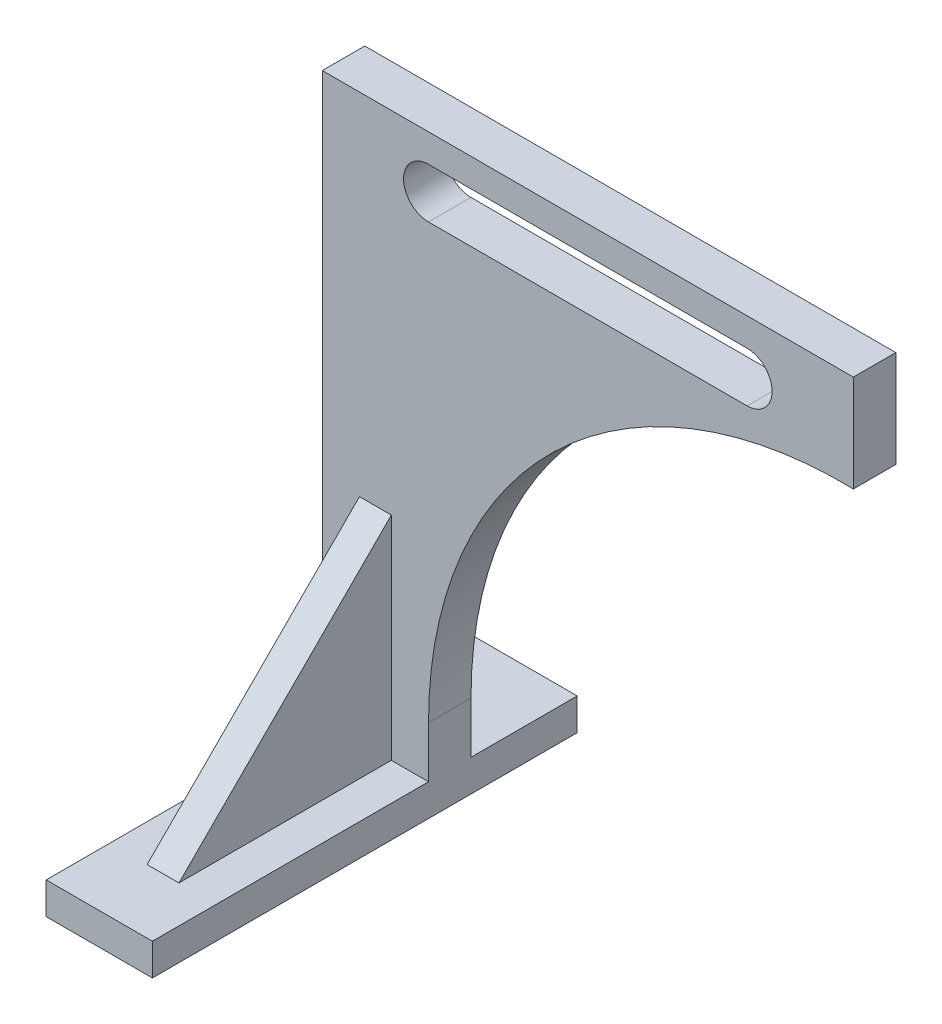
ISO-10303-21;
HEADER;
FILE_DESCRIPTION(('STEP AP214'),'2;1');
FILE_NAME('part.step','',(''),(''),'','','');
FILE_SCHEMA(('AUTOMOTIVE_DESIGN { 1 0 10303 214 1 1 1 1 }'));
ENDSEC;
DATA;
#1=APPLICATION_CONTEXT('core data for automotive mechanical design processes');
#2=APPLICATION_PROTOCOL_DEFINITION('international standard','automotive_design',2000,#1);
#3=PRODUCT_CONTEXT('',#1,'mechanical');
#4=PRODUCT('Part','Part','',(#3));
#5=PRODUCT_RELATED_PRODUCT_CATEGORY('part','',(#4));
#6=PRODUCT_DEFINITION_FORMATION('','',#4);
#7=PRODUCT_DEFINITION_CONTEXT('part definition',#1,'design');
#8=PRODUCT_DEFINITION('design','',#6,#7);
#9=PRODUCT_DEFINITION_SHAPE('','',#8);
#10=(LENGTH_UNIT() NAMED_UNIT(*) SI_UNIT(.MILLI.,.METRE.));
#11=(NAMED_UNIT(*) PLANE_ANGLE_UNIT() SI_UNIT($,.RADIAN.));
#12=(NAMED_UNIT(*) SI_UNIT($,.STERADIAN.) SOLID_ANGLE_UNIT());
#13=UNCERTAINTY_MEASURE_WITH_UNIT(LENGTH_MEASURE(1.E-05),#10,'distance_accuracy_value','');
#14=(GEOMETRIC_REPRESENTATION_CONTEXT(3) GLOBAL_UNCERTAINTY_ASSIGNED_CONTEXT((#13)) GLOBAL_UNIT_ASSIGNED_CONTEXT((#10,
#11,#12)) REPRESENTATION_CONTEXT('',''));
#15=CARTESIAN_POINT('',(0.,0.,0.));
#16=DIRECTION('',(0.,0.,1.));
#17=DIRECTION('',(1.,0.,0.));
#18=AXIS2_PLACEMENT_3D('',#15,#16,#17);
#19=CARTESIAN_POINT('',(-125.,-132.5,-20.));
#20=DIRECTION('',(-1.,0.,0.));
#21=DIRECTION('',(0.,0.,1.));
#22=AXIS2_PLACEMENT_3D('',#19,#20,#21);
#23=PLANE('',#22);
#24=DIRECTION('',(0.,-1.,0.));
#25=VECTOR('',#24,1.);
#26=CARTESIAN_POINT('',(-125.,-132.5,0.));
#27=LINE('',#26,#25);
#28=CARTESIAN_POINT('',(-125.,132.5,0.));
#29=VERTEX_POINT('',#28);
#30=CARTESIAN_POINT('',(-125.,-132.5,0.));
#31=VERTEX_POINT('',#30);
#32=EDGE_CURVE('E234',#29,#31,#27,.T.);
#33=ORIENTED_EDGE('',*,*,#32,.F.);
#34=DIRECTION('',(0.,0.,1.));
#35=VECTOR('',#34,1.);
#36=CARTESIAN_POINT('',(-125.,132.5,-20.));
#37=LINE('',#36,#35);
#38=CARTESIAN_POINT('',(-125.,132.5,-20.));
#39=VERTEX_POINT('',#38);
#40=EDGE_CURVE('E11',#39,#29,#37,.T.);
#41=ORIENTED_EDGE('',*,*,#40,.F.);
#42=DIRECTION('',(0.,-1.,0.));
#43=VECTOR('',#42,1.);
#44=CARTESIAN_POINT('',(-125.,-132.5,-20.));
#45=LINE('',#44,#43);
#46=CARTESIAN_POINT('',(-125.,-132.5,-20.));
#47=VERTEX_POINT('',#46);
#48=EDGE_CURVE('E235',#39,#47,#45,.T.);
#49=ORIENTED_EDGE('',*,*,#48,.T.);
#50=DIRECTION('',(0.,0.,-1.));
#51=VECTOR('',#50,1.);
#52=CARTESIAN_POINT('',(-125.,-132.5,-70.));
#53=LINE('',#52,#51);
#54=CARTESIAN_POINT('',(-125.,-132.5,-70.));
#55=VERTEX_POINT('',#54);
#56=EDGE_CURVE('E346',#47,#55,#53,.T.);
#57=ORIENTED_EDGE('',*,*,#56,.T.);
#58=DIRECTION('',(0.,1.,0.));
#59=VECTOR('',#58,1.);
#60=CARTESIAN_POINT('',(-125.,-147.5,-70.));
#61=LINE('',#60,#59);
#62=CARTESIAN_POINT('',(-125.,-147.5,-70.));
#63=VERTEX_POINT('',#62);
#64=EDGE_CURVE('E383',#63,#55,#61,.T.);
#65=ORIENTED_EDGE('',*,*,#64,.F.);
#66=DIRECTION('',(0.,0.,-1.));
#67=VECTOR('',#66,1.);
#68=CARTESIAN_POINT('',(-125.,-147.5,-70.));
#69=LINE('',#68,#67);
#70=CARTESIAN_POINT('',(-125.,-147.5,130.));
#71=VERTEX_POINT('',#70);
#72=EDGE_CURVE('E371',#71,#63,#69,.T.);
#73=ORIENTED_EDGE('',*,*,#72,.F.);
#74=DIRECTION('',(0.,1.,0.));
#75=VECTOR('',#74,1.);
#76=CARTESIAN_POINT('',(-125.,-147.5,130.));
#77=LINE('',#76,#75);
#78=CARTESIAN_POINT('',(-125.,-132.5,130.));
#79=VERTEX_POINT('',#78);
#80=EDGE_CURVE('E372',#71,#79,#77,.T.);
#81=ORIENTED_EDGE('',*,*,#80,.T.);
#82=EDGE_CURVE('E339',#79,#31,#53,.T.);
#83=ORIENTED_EDGE('',*,*,#82,.T.);
#84=EDGE_LOOP('',(#33,#41,#49,#57,#65,#73,#81,#83));
#85=FACE_BOUND('',#84,.T.);
#86=ADVANCED_FACE('F42',(#85),#23,.T.);
#87=CARTESIAN_POINT('',(125.,132.5,-20.));
#88=DIRECTION('',(0.,1.,0.));
#89=DIRECTION('',(0.,0.,1.));
#90=AXIS2_PLACEMENT_3D('',#87,#88,#89);
#91=PLANE('',#90);
#92=DIRECTION('',(-1.,0.,0.));
#93=VECTOR('',#92,1.);
#94=CARTESIAN_POINT('',(125.,132.5,0.));
#95=LINE('',#94,#93);
#96=CARTESIAN_POINT('',(125.,132.5,0.));
#97=VERTEX_POINT('',#96);
#98=EDGE_CURVE('E240',#97,#29,#95,.T.);
#99=ORIENTED_EDGE('',*,*,#98,.F.);
#100=DIRECTION('',(0.,0.,1.));
#101=VECTOR('',#100,1.);
#102=CARTESIAN_POINT('',(125.,132.5,-20.));
#103=LINE('',#102,#101);
#104=CARTESIAN_POINT('',(125.,132.5,-20.));
#105=VERTEX_POINT('',#104);
#106=EDGE_CURVE('E51',#105,#97,#103,.T.);
#107=ORIENTED_EDGE('',*,*,#106,.F.);
#108=DIRECTION('',(-1.,0.,0.));
#109=VECTOR('',#108,1.);
#110=CARTESIAN_POINT('',(125.,132.5,-20.));
#111=LINE('',#110,#109);
#112=EDGE_CURVE('E256',#105,#39,#111,.T.);
#113=ORIENTED_EDGE('',*,*,#112,.T.);
#114=ORIENTED_EDGE('',*,*,#40,.T.);
#115=EDGE_LOOP('',(#99,#107,#113,#114));
#116=FACE_BOUND('',#115,.T.);
#117=ADVANCED_FACE('F326',(#116),#91,.T.);
#118=CARTESIAN_POINT('',(125.,86.8752225812341,-20.));
#119=DIRECTION('',(1.,0.,0.));
#120=DIRECTION('',(0.,1.,0.));
#121=AXIS2_PLACEMENT_3D('',#118,#119,#120);
#122=PLANE('',#121);
#123=DIRECTION('',(0.,1.,0.));
#124=VECTOR('',#123,1.);
#125=CARTESIAN_POINT('',(125.,86.8752225812341,0.));
#126=LINE('',#125,#124);
#127=CARTESIAN_POINT('',(125.,86.8752225812341,0.));
#128=VERTEX_POINT('',#127);
#129=EDGE_CURVE('E274',#128,#97,#126,.T.);
#130=ORIENTED_EDGE('',*,*,#129,.F.);
#131=DIRECTION('',(0.,0.,1.));
#132=VECTOR('',#131,1.);
#133=CARTESIAN_POINT('',(125.,86.8752225812341,-20.));
#134=LINE('',#133,#132);
#135=CARTESIAN_POINT('',(125.,86.8752225812341,-20.));
#136=VERTEX_POINT('',#135);
#137=EDGE_CURVE('E282',#136,#128,#134,.T.);
#138=ORIENTED_EDGE('',*,*,#137,.F.);
#139=DIRECTION('',(0.,1.,0.));
#140=VECTOR('',#139,1.);
#141=CARTESIAN_POINT('',(125.,86.8752225812341,-20.));
#142=LINE('',#141,#140);
#143=EDGE_CURVE('E252',#136,#105,#142,.T.);
#144=ORIENTED_EDGE('',*,*,#143,.T.);
#145=ORIENTED_EDGE('',*,*,#106,.T.);
#146=EDGE_LOOP('',(#130,#138,#144,#145));
#147=FACE_BOUND('',#146,.T.);
#148=ADVANCED_FACE('F331',(#147),#122,.T.);
#149=CARTESIAN_POINT('',(120.3,-108.368215208618,-20.));
#150=DIRECTION('',(0.,0.,1.));
#151=DIRECTION('',(1.,0.,0.));
#152=AXIS2_PLACEMENT_3D('',#149,#150,#151);
#153=CYLINDRICAL_SURFACE('',#152,195.3);
#154=CARTESIAN_POINT('',(120.3,-108.368215208618,0.));
#155=DIRECTION('',(0.,0.,-1.));
#156=DIRECTION('',(1.,0.,0.));
#157=AXIS2_PLACEMENT_3D('',#154,#155,#156);
#158=CIRCLE('',#157,195.3);
#159=CARTESIAN_POINT('',(-75.,-108.368215208618,0.));
#160=VERTEX_POINT('',#159);
#161=EDGE_CURVE('E270',#160,#128,#158,.T.);
#162=ORIENTED_EDGE('',*,*,#161,.F.);
#163=DIRECTION('',(0.,0.,1.));
#164=VECTOR('',#163,1.);
#165=CARTESIAN_POINT('',(-75.,-108.368215208618,-20.));
#166=LINE('',#165,#164);
#167=CARTESIAN_POINT('',(-75.,-108.368215208618,-20.));
#168=VERTEX_POINT('',#167);
#169=EDGE_CURVE('E45',#168,#160,#166,.T.);
#170=ORIENTED_EDGE('',*,*,#169,.F.);
#171=CARTESIAN_POINT('',(120.3,-108.368215208618,-20.));
#172=DIRECTION('',(0.,0.,-1.));
#173=DIRECTION('',(1.,0.,0.));
#174=AXIS2_PLACEMENT_3D('',#171,#172,#173);
#175=CIRCLE('',#174,195.3);
#176=EDGE_CURVE('E248',#168,#136,#175,.T.);
#177=ORIENTED_EDGE('',*,*,#176,.T.);
#178=ORIENTED_EDGE('',*,*,#137,.T.);
#179=EDGE_LOOP('',(#162,#170,#177,#178));
#180=FACE_BOUND('',#179,.T.);
#181=ADVANCED_FACE('F293',(#180),#153,.F.);
#182=CARTESIAN_POINT('',(-75.,-132.5,-20.));
#183=DIRECTION('',(1.,0.,0.));
#184=DIRECTION('',(0.,1.,0.));
#185=AXIS2_PLACEMENT_3D('',#182,#183,#184);
#186=PLANE('',#185);
#187=DIRECTION('',(0.,1.,0.));
#188=VECTOR('',#187,1.);
#189=CARTESIAN_POINT('',(-75.,-132.5,0.));
#190=LINE('',#189,#188);
#191=CARTESIAN_POINT('',(-75.,-132.5,0.));
#192=VERTEX_POINT('',#191);
#193=EDGE_CURVE('E266',#192,#160,#190,.T.);
#194=ORIENTED_EDGE('',*,*,#193,.F.);
#195=DIRECTION('',(0.,0.,1.));
#196=VECTOR('',#195,1.);
#197=CARTESIAN_POINT('',(-75.,-132.5,-70.));
#198=LINE('',#197,#196);
#199=CARTESIAN_POINT('',(-75.,-132.5,130.));
#200=VERTEX_POINT('',#199);
#201=EDGE_CURVE('E364',#192,#200,#198,.T.);
#202=ORIENTED_EDGE('',*,*,#201,.T.);
#203=DIRECTION('',(0.,1.,0.));
#204=VECTOR('',#203,1.);
#205=CARTESIAN_POINT('',(-75.,-147.5,130.));
#206=LINE('',#205,#204);
#207=CARTESIAN_POINT('',(-75.,-147.5,130.));
#208=VERTEX_POINT('',#207);
#209=EDGE_CURVE('E375',#208,#200,#206,.T.);
#210=ORIENTED_EDGE('',*,*,#209,.F.);
#211=DIRECTION('',(0.,0.,1.));
#212=VECTOR('',#211,1.);
#213=CARTESIAN_POINT('',(-75.,-147.5,-70.));
#214=LINE('',#213,#212);
#215=CARTESIAN_POINT('',(-75.,-147.5,-70.));
#216=VERTEX_POINT('',#215);
#217=EDGE_CURVE('E405',#216,#208,#214,.T.);
#218=ORIENTED_EDGE('',*,*,#217,.F.);
#219=DIRECTION('',(0.,1.,0.));
#220=VECTOR('',#219,1.);
#221=CARTESIAN_POINT('',(-75.,-147.5,-70.));
#222=LINE('',#221,#220);
#223=CARTESIAN_POINT('',(-75.,-132.5,-70.));
#224=VERTEX_POINT('',#223);
#225=EDGE_CURVE('E379',#216,#224,#222,.T.);
#226=ORIENTED_EDGE('',*,*,#225,.T.);
#227=CARTESIAN_POINT('',(-75.,-132.5,-20.));
#228=VERTEX_POINT('',#227);
#229=EDGE_CURVE('E365',#224,#228,#198,.T.);
#230=ORIENTED_EDGE('',*,*,#229,.T.);
#231=DIRECTION('',(0.,1.,0.));
#232=VECTOR('',#231,1.);
#233=CARTESIAN_POINT('',(-75.,-132.5,-20.));
#234=LINE('',#233,#232);
#235=EDGE_CURVE('E244',#228,#168,#234,.T.);
#236=ORIENTED_EDGE('',*,*,#235,.T.);
#237=ORIENTED_EDGE('',*,*,#169,.T.);
#238=EDGE_LOOP('',(#194,#202,#210,#218,#226,#230,#236,#237));
#239=FACE_BOUND('',#238,.T.);
#240=ADVANCED_FACE('F290',(#239),#186,.T.);
#241=CARTESIAN_POINT('',(120.3,-108.368215208618,-20.));
#242=DIRECTION('',(0.,0.,1.));
#243=DIRECTION('',(1.,0.,0.));
#244=AXIS2_PLACEMENT_3D('',#241,#242,#243);
#245=PLANE('',#244);
#246=DIRECTION('',(-1.,0.,0.));
#247=VECTOR('',#246,1.);
#248=CARTESIAN_POINT('',(120.3,119.25,-20.));
#249=LINE('',#248,#247);
#250=CARTESIAN_POINT('',(75.,119.25,-20.));
#251=VERTEX_POINT('',#250);
#252=CARTESIAN_POINT('',(-75.,119.25,-20.));
#253=VERTEX_POINT('',#252);
#254=EDGE_CURVE('E226',#251,#253,#249,.T.);
#255=ORIENTED_EDGE('',*,*,#254,.T.);
#256=CARTESIAN_POINT('',(-75.,107.5,-20.));
#257=DIRECTION('',(0.,0.,1.));
#258=DIRECTION('',(1.,0.,0.));
#259=AXIS2_PLACEMENT_3D('',#256,#257,#258);
#260=CIRCLE('',#259,11.75);
#261=CARTESIAN_POINT('',(-75.,95.75,-20.));
#262=VERTEX_POINT('',#261);
#263=EDGE_CURVE('E230',#253,#262,#260,.T.);
#264=ORIENTED_EDGE('',*,*,#263,.T.);
#265=DIRECTION('',(1.,0.,0.));
#266=VECTOR('',#265,1.);
#267=CARTESIAN_POINT('',(120.3,95.75,-20.));
#268=LINE('',#267,#266);
#269=CARTESIAN_POINT('',(75.,95.75,-20.));
#270=VERTEX_POINT('',#269);
#271=EDGE_CURVE('E210',#262,#270,#268,.T.);
#272=ORIENTED_EDGE('',*,*,#271,.T.);
#273=CARTESIAN_POINT('',(75.,107.5,-20.));
#274=DIRECTION('',(0.,0.,1.));
#275=DIRECTION('',(1.,0.,0.));
#276=AXIS2_PLACEMENT_3D('',#273,#274,#275);
#277=CIRCLE('',#276,11.75);
#278=EDGE_CURVE('E222',#270,#251,#277,.T.);
#279=ORIENTED_EDGE('',*,*,#278,.T.);
#280=EDGE_LOOP('',(#255,#264,#272,#279));
#281=FACE_BOUND('',#280,.T.);
#282=ORIENTED_EDGE('',*,*,#48,.F.);
#283=ORIENTED_EDGE('',*,*,#112,.F.);
#284=ORIENTED_EDGE('',*,*,#143,.F.);
#285=ORIENTED_EDGE('',*,*,#176,.F.);
#286=ORIENTED_EDGE('',*,*,#235,.F.);
#287=DIRECTION('',(1.,0.,0.));
#288=VECTOR('',#287,1.);
#289=CARTESIAN_POINT('',(-75.,-132.5,-20.));
#290=LINE('',#289,#288);
#291=EDGE_CURVE('E239',#47,#228,#290,.T.);
#292=ORIENTED_EDGE('',*,*,#291,.F.);
#293=EDGE_LOOP('',(#282,#283,#284,#285,#286,#292));
#294=FACE_BOUND('',#293,.T.);
#295=ADVANCED_FACE('F300',(#281,#294),#245,.F.);
#296=CARTESIAN_POINT('',(120.3,-108.368215208618,0.));
#297=DIRECTION('',(0.,0.,1.));
#298=DIRECTION('',(1.,0.,0.));
#299=AXIS2_PLACEMENT_3D('',#296,#297,#298);
#300=PLANE('',#299);
#301=DIRECTION('',(0.,-1.,0.));
#302=VECTOR('',#301,1.);
#303=CARTESIAN_POINT('',(-107.5,-132.5,0.));
#304=LINE('',#303,#302);
#305=CARTESIAN_POINT('',(-107.5,-32.5,0.));
#306=VERTEX_POINT('',#305);
#307=CARTESIAN_POINT('',(-107.5,-132.5,0.));
#308=VERTEX_POINT('',#307);
#309=EDGE_CURVE('E174',#306,#308,#304,.T.);
#310=ORIENTED_EDGE('',*,*,#309,.F.);
#311=DIRECTION('',(-1.,0.,0.));
#312=VECTOR('',#311,1.);
#313=CARTESIAN_POINT('',(-107.5,-32.5,0.));
#314=LINE('',#313,#312);
#315=CARTESIAN_POINT('',(-92.5,-32.5,0.));
#316=VERTEX_POINT('',#315);
#317=EDGE_CURVE('E387',#316,#306,#314,.T.);
#318=ORIENTED_EDGE('',*,*,#317,.F.);
#319=DIRECTION('',(0.,1.,0.));
#320=VECTOR('',#319,1.);
#321=CARTESIAN_POINT('',(-92.5,-132.5,0.));
#322=LINE('',#321,#320);
#323=CARTESIAN_POINT('',(-92.5,-132.5,0.));
#324=VERTEX_POINT('',#323);
#325=EDGE_CURVE('E59',#324,#316,#322,.T.);
#326=ORIENTED_EDGE('',*,*,#325,.F.);
#327=DIRECTION('',(1.,0.,0.));
#328=VECTOR('',#327,1.);
#329=CARTESIAN_POINT('',(-75.,-132.5,0.));
#330=LINE('',#329,#328);
#331=EDGE_CURVE('E183',#324,#192,#330,.T.);
#332=ORIENTED_EDGE('',*,*,#331,.T.);
#333=ORIENTED_EDGE('',*,*,#193,.T.);
#334=ORIENTED_EDGE('',*,*,#161,.T.);
#335=ORIENTED_EDGE('',*,*,#129,.T.);
#336=ORIENTED_EDGE('',*,*,#98,.T.);
#337=ORIENTED_EDGE('',*,*,#32,.T.);
#338=EDGE_CURVE('E262',#31,#308,#330,.T.);
#339=ORIENTED_EDGE('',*,*,#338,.T.);
#340=EDGE_LOOP('',(#310,#318,#326,#332,#333,#334,#335,#336,#337,#339));
#341=FACE_BOUND('',#340,.T.);
#342=CARTESIAN_POINT('',(-75.,107.5,0.));
#343=DIRECTION('',(0.,0.,1.));
#344=DIRECTION('',(1.,0.,0.));
#345=AXIS2_PLACEMENT_3D('',#342,#343,#344);
#346=CIRCLE('',#345,11.75);
#347=CARTESIAN_POINT('',(-75.,119.25,0.));
#348=VERTEX_POINT('',#347);
#349=CARTESIAN_POINT('',(-75.,95.75,0.));
#350=VERTEX_POINT('',#349);
#351=EDGE_CURVE('E188',#348,#350,#346,.T.);
#352=ORIENTED_EDGE('',*,*,#351,.F.);
#353=DIRECTION('',(-1.,0.,0.));
#354=VECTOR('',#353,1.);
#355=CARTESIAN_POINT('',(-75.,119.25,0.));
#356=LINE('',#355,#354);
#357=CARTESIAN_POINT('',(75.,119.25,0.));
#358=VERTEX_POINT('',#357);
#359=EDGE_CURVE('E202',#358,#348,#356,.T.);
#360=ORIENTED_EDGE('',*,*,#359,.F.);
#361=CARTESIAN_POINT('',(75.,107.5,0.));
#362=DIRECTION('',(0.,0.,1.));
#363=DIRECTION('',(1.,0.,0.));
#364=AXIS2_PLACEMENT_3D('',#361,#362,#363);
#365=CIRCLE('',#364,11.75);
#366=CARTESIAN_POINT('',(75.,95.75,0.));
#367=VERTEX_POINT('',#366);
#368=EDGE_CURVE('E198',#367,#358,#365,.T.);
#369=ORIENTED_EDGE('',*,*,#368,.F.);
#370=DIRECTION('',(1.,0.,0.));
#371=VECTOR('',#370,1.);
#372=CARTESIAN_POINT('',(-75.,95.75,0.));
#373=LINE('',#372,#371);
#374=EDGE_CURVE('E195',#350,#367,#373,.T.);
#375=ORIENTED_EDGE('',*,*,#374,.F.);
#376=EDGE_LOOP('',(#352,#360,#369,#375));
#377=FACE_BOUND('',#376,.T.);
#378=ADVANCED_FACE('F295',(#341,#377),#300,.T.);
#379=CARTESIAN_POINT('',(-75.,107.5,-80.));
#380=DIRECTION('',(0.,0.,1.));
#381=DIRECTION('',(1.,0.,0.));
#382=AXIS2_PLACEMENT_3D('',#379,#380,#381);
#383=CYLINDRICAL_SURFACE('',#382,11.75);
#384=DIRECTION('',(0.,0.,1.));
#385=VECTOR('',#384,1.);
#386=CARTESIAN_POINT('',(-75.,119.25,-80.));
#387=LINE('',#386,#385);
#388=EDGE_CURVE('E207',#253,#348,#387,.T.);
#389=ORIENTED_EDGE('',*,*,#388,.T.);
#390=ORIENTED_EDGE('',*,*,#351,.T.);
#391=DIRECTION('',(0.,0.,1.));
#392=VECTOR('',#391,1.);
#393=CARTESIAN_POINT('',(-75.,95.75,-80.));
#394=LINE('',#393,#392);
#395=EDGE_CURVE('E206',#262,#350,#394,.T.);
#396=ORIENTED_EDGE('',*,*,#395,.F.);
#397=ORIENTED_EDGE('',*,*,#263,.F.);
#398=EDGE_LOOP('',(#389,#390,#396,#397));
#399=FACE_BOUND('',#398,.T.);
#400=ADVANCED_FACE('F299',(#399),#383,.F.);
#401=CARTESIAN_POINT('',(-75.,119.25,-80.));
#402=DIRECTION('',(0.,1.,0.));
#403=DIRECTION('',(0.,0.,1.));
#404=AXIS2_PLACEMENT_3D('',#401,#402,#403);
#405=PLANE('',#404);
#406=DIRECTION('',(0.,0.,1.));
#407=VECTOR('',#406,1.);
#408=CARTESIAN_POINT('',(75.,119.25,-80.));
#409=LINE('',#408,#407);
#410=EDGE_CURVE('E211',#251,#358,#409,.T.);
#411=ORIENTED_EDGE('',*,*,#410,.T.);
#412=ORIENTED_EDGE('',*,*,#359,.T.);
#413=ORIENTED_EDGE('',*,*,#388,.F.);
#414=ORIENTED_EDGE('',*,*,#254,.F.);
#415=EDGE_LOOP('',(#411,#412,#413,#414));
#416=FACE_BOUND('',#415,.T.);
#417=ADVANCED_FACE('F313',(#416),#405,.F.);
#418=CARTESIAN_POINT('',(75.,107.5,-80.));
#419=DIRECTION('',(0.,0.,1.));
#420=DIRECTION('',(1.,0.,0.));
#421=AXIS2_PLACEMENT_3D('',#418,#419,#420);
#422=CYLINDRICAL_SURFACE('',#421,11.75);
#423=DIRECTION('',(0.,0.,1.));
#424=VECTOR('',#423,1.);
#425=CARTESIAN_POINT('',(75.,95.75,-80.));
#426=LINE('',#425,#424);
#427=EDGE_CURVE('E67',#270,#367,#426,.T.);
#428=ORIENTED_EDGE('',*,*,#427,.T.);
#429=ORIENTED_EDGE('',*,*,#368,.T.);
#430=ORIENTED_EDGE('',*,*,#410,.F.);
#431=ORIENTED_EDGE('',*,*,#278,.F.);
#432=EDGE_LOOP('',(#428,#429,#430,#431));
#433=FACE_BOUND('',#432,.T.);
#434=ADVANCED_FACE('F316',(#433),#422,.F.);
#435=CARTESIAN_POINT('',(-75.,95.75,-80.));
#436=DIRECTION('',(0.,-1.,0.));
#437=DIRECTION('',(0.,0.,-1.));
#438=AXIS2_PLACEMENT_3D('',#435,#436,#437);
#439=PLANE('',#438);
#440=ORIENTED_EDGE('',*,*,#395,.T.);
#441=ORIENTED_EDGE('',*,*,#374,.T.);
#442=ORIENTED_EDGE('',*,*,#427,.F.);
#443=ORIENTED_EDGE('',*,*,#271,.F.);
#444=EDGE_LOOP('',(#440,#441,#442,#443));
#445=FACE_BOUND('',#444,.T.);
#446=ADVANCED_FACE('F309',(#445),#439,.F.);
#447=CARTESIAN_POINT('',(-92.5,-132.5,100.));
#448=DIRECTION('',(-1.,0.,0.));
#449=DIRECTION('',(0.,0.,1.));
#450=AXIS2_PLACEMENT_3D('',#447,#448,#449);
#451=PLANE('',#450);
#452=ORIENTED_EDGE('',*,*,#325,.T.);
#453=DIRECTION('',(0.,0.707106781186547,-0.707106781186547));
#454=VECTOR('',#453,1.);
#455=CARTESIAN_POINT('',(-92.5,-32.5,0.));
#456=LINE('',#455,#454);
#457=CARTESIAN_POINT('',(-92.5,-132.5,100.));
#458=VERTEX_POINT('',#457);
#459=EDGE_CURVE('E165',#458,#316,#456,.T.);
#460=ORIENTED_EDGE('',*,*,#459,.F.);
#461=DIRECTION('',(0.,0.,-1.));
#462=VECTOR('',#461,1.);
#463=CARTESIAN_POINT('',(-92.5,-132.5,100.));
#464=LINE('',#463,#462);
#465=EDGE_CURVE('E173',#458,#324,#464,.T.);
#466=ORIENTED_EDGE('',*,*,#465,.T.);
#467=EDGE_LOOP('',(#452,#460,#466));
#468=FACE_BOUND('',#467,.T.);
#469=ADVANCED_FACE('F177',(#468),#451,.F.);
#470=CARTESIAN_POINT('',(-107.5,-132.5,100.));
#471=DIRECTION('',(1.,0.,0.));
#472=DIRECTION('',(0.,0.,-1.));
#473=AXIS2_PLACEMENT_3D('',#470,#471,#472);
#474=PLANE('',#473);
#475=DIRECTION('',(0.,0.,-1.));
#476=VECTOR('',#475,1.);
#477=CARTESIAN_POINT('',(-107.5,-132.5,100.));
#478=LINE('',#477,#476);
#479=CARTESIAN_POINT('',(-107.5,-132.5,100.));
#480=VERTEX_POINT('',#479);
#481=EDGE_CURVE('E185',#480,#308,#478,.T.);
#482=ORIENTED_EDGE('',*,*,#481,.F.);
#483=DIRECTION('',(0.,0.707106781186548,-0.707106781186548));
#484=VECTOR('',#483,1.);
#485=CARTESIAN_POINT('',(-107.5,-132.5,100.));
#486=LINE('',#485,#484);
#487=EDGE_CURVE('E167',#480,#306,#486,.T.);
#488=ORIENTED_EDGE('',*,*,#487,.T.);
#489=ORIENTED_EDGE('',*,*,#309,.T.);
#490=EDGE_LOOP('',(#482,#488,#489));
#491=FACE_BOUND('',#490,.T.);
#492=ADVANCED_FACE('F391',(#491),#474,.F.);
#493=CARTESIAN_POINT('',(0.,-132.5,0.));
#494=DIRECTION('',(0.,-1.,0.));
#495=DIRECTION('',(0.,0.,-1.));
#496=AXIS2_PLACEMENT_3D('',#493,#494,#495);
#497=PLANE('',#496);
#498=ORIENTED_EDGE('',*,*,#56,.F.);
#499=ORIENTED_EDGE('',*,*,#291,.T.);
#500=ORIENTED_EDGE('',*,*,#229,.F.);
#501=DIRECTION('',(1.,0.,0.));
#502=VECTOR('',#501,1.);
#503=CARTESIAN_POINT('',(-75.,-132.5,-70.));
#504=LINE('',#503,#502);
#505=EDGE_CURVE('E351',#55,#224,#504,.T.);
#506=ORIENTED_EDGE('',*,*,#505,.F.);
#507=EDGE_LOOP('',(#498,#499,#500,#506));
#508=FACE_BOUND('',#507,.T.);
#509=ADVANCED_FACE('F349',(#508),#497,.F.);
#510=CARTESIAN_POINT('',(-75.,-147.5,-70.));
#511=DIRECTION('',(0.,0.,1.));
#512=DIRECTION('',(1.,0.,0.));
#513=AXIS2_PLACEMENT_3D('',#510,#511,#512);
#514=PLANE('',#513);
#515=ORIENTED_EDGE('',*,*,#505,.T.);
#516=ORIENTED_EDGE('',*,*,#225,.F.);
#517=DIRECTION('',(1.,0.,0.));
#518=VECTOR('',#517,1.);
#519=CARTESIAN_POINT('',(-75.,-147.5,-70.));
#520=LINE('',#519,#518);
#521=EDGE_CURVE('E402',#63,#216,#520,.T.);
#522=ORIENTED_EDGE('',*,*,#521,.F.);
#523=ORIENTED_EDGE('',*,*,#64,.T.);
#524=EDGE_LOOP('',(#515,#516,#522,#523));
#525=FACE_BOUND('',#524,.T.);
#526=ADVANCED_FACE('F418',(#525),#514,.F.);
#527=CARTESIAN_POINT('',(-75.,-147.5,130.));
#528=DIRECTION('',(0.,0.,-1.));
#529=DIRECTION('',(-1.,0.,0.));
#530=AXIS2_PLACEMENT_3D('',#527,#528,#529);
#531=PLANE('',#530);
#532=DIRECTION('',(-1.,0.,0.));
#533=VECTOR('',#532,1.);
#534=CARTESIAN_POINT('',(-75.,-132.5,130.));
#535=LINE('',#534,#533);
#536=EDGE_CURVE('E368',#200,#79,#535,.T.);
#537=ORIENTED_EDGE('',*,*,#536,.T.);
#538=ORIENTED_EDGE('',*,*,#80,.F.);
#539=DIRECTION('',(-1.,0.,0.));
#540=VECTOR('',#539,1.);
#541=CARTESIAN_POINT('',(-75.,-147.5,130.));
#542=LINE('',#541,#540);
#543=EDGE_CURVE('E360',#208,#71,#542,.T.);
#544=ORIENTED_EDGE('',*,*,#543,.F.);
#545=ORIENTED_EDGE('',*,*,#209,.T.);
#546=EDGE_LOOP('',(#537,#538,#544,#545));
#547=FACE_BOUND('',#546,.T.);
#548=ADVANCED_FACE('F395',(#547),#531,.F.);
#549=CARTESIAN_POINT('',(0.,-147.5,0.));
#550=DIRECTION('',(0.,-1.,0.));
#551=DIRECTION('',(0.,0.,-1.));
#552=AXIS2_PLACEMENT_3D('',#549,#550,#551);
#553=PLANE('',#552);
#554=ORIENTED_EDGE('',*,*,#72,.T.);
#555=ORIENTED_EDGE('',*,*,#521,.T.);
#556=ORIENTED_EDGE('',*,*,#217,.T.);
#557=ORIENTED_EDGE('',*,*,#543,.T.);
#558=EDGE_LOOP('',(#554,#555,#556,#557));
#559=FACE_BOUND('',#558,.T.);
#560=ADVANCED_FACE('F410',(#559),#553,.T.);
#561=DIRECTION('',(1.,0.,0.));
#562=VECTOR('',#561,1.);
#563=CARTESIAN_POINT('',(-107.5,-132.5,100.));
#564=LINE('',#563,#562);
#565=EDGE_CURVE('E162',#480,#458,#564,.T.);
#566=ORIENTED_EDGE('',*,*,#565,.F.);
#567=ORIENTED_EDGE('',*,*,#481,.T.);
#568=ORIENTED_EDGE('',*,*,#338,.F.);
#569=ORIENTED_EDGE('',*,*,#82,.F.);
#570=ORIENTED_EDGE('',*,*,#536,.F.);
#571=ORIENTED_EDGE('',*,*,#201,.F.);
#572=ORIENTED_EDGE('',*,*,#331,.F.);
#573=ORIENTED_EDGE('',*,*,#465,.F.);
#574=EDGE_LOOP('',(#566,#567,#568,#569,#570,#571,#572,#573));
#575=FACE_BOUND('',#574,.T.);
#576=ADVANCED_FACE('F181',(#575),#497,.F.);
#577=CARTESIAN_POINT('',(-258.5,-32.5,0.));
#578=DIRECTION('',(0.,-0.707106781186547,-0.707106781186547));
#579=DIRECTION('',(0.,0.707106781186548,-0.707106781186548));
#580=AXIS2_PLACEMENT_3D('',#577,#578,#579);
#581=PLANE('',#580);
#582=ORIENTED_EDGE('',*,*,#565,.T.);
#583=ORIENTED_EDGE('',*,*,#459,.T.);
#584=ORIENTED_EDGE('',*,*,#317,.T.);
#585=ORIENTED_EDGE('',*,*,#487,.F.);
#586=EDGE_LOOP('',(#582,#583,#584,#585));
#587=FACE_BOUND('',#586,.T.);
#588=ADVANCED_FACE('F164',(#587),#581,.F.);
#589=CLOSED_SHELL('',(#86,#117,#148,#181,#240,#295,#378,#400,#417,#434,#446,#469,#492,#509,#526,
#548,#560,#576,#588));
#590=MANIFOLD_SOLID_BREP('B2',#589);
#591=ADVANCED_BREP_SHAPE_REPRESENTATION('',(#18,#590),#14);
#592=SHAPE_DEFINITION_REPRESENTATION(#9,#591);
ENDSEC;
END-ISO-10303-21;
